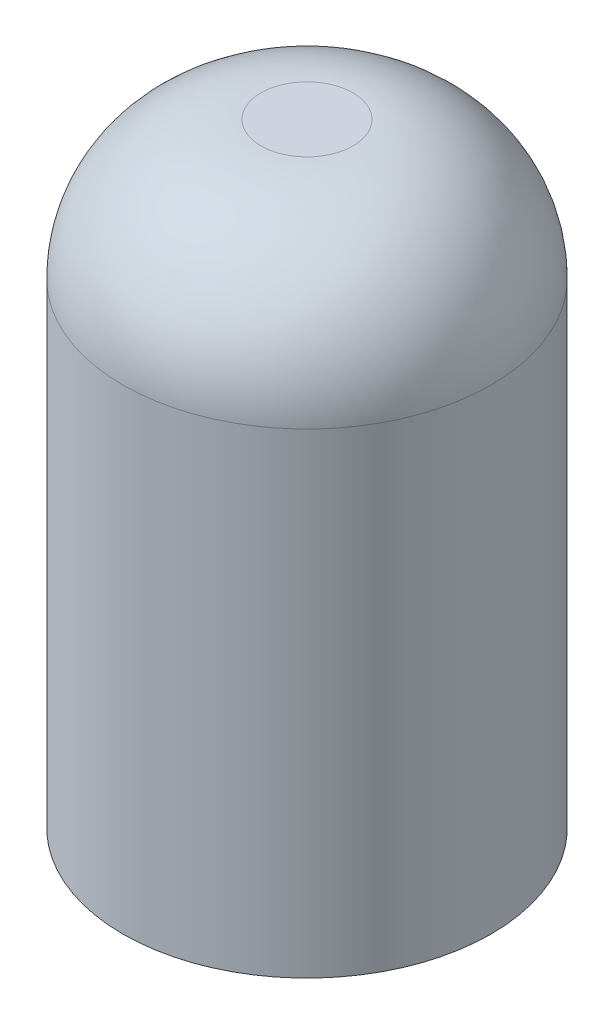
ISO-10303-21;
HEADER;
FILE_DESCRIPTION(('STEP AP214'),'2;1');
FILE_NAME('part.step','',(''),(''),'','','');
FILE_SCHEMA(('AUTOMOTIVE_DESIGN { 1 0 10303 214 1 1 1 1 }'));
ENDSEC;
DATA;
#1=APPLICATION_CONTEXT('core data for automotive mechanical design processes');
#2=APPLICATION_PROTOCOL_DEFINITION('international standard','automotive_design',2000,#1);
#3=PRODUCT_CONTEXT('',#1,'mechanical');
#4=PRODUCT('Part','Part','',(#3));
#5=PRODUCT_RELATED_PRODUCT_CATEGORY('part','',(#4));
#6=PRODUCT_DEFINITION_FORMATION('','',#4);
#7=PRODUCT_DEFINITION_CONTEXT('part definition',#1,'design');
#8=PRODUCT_DEFINITION('design','',#6,#7);
#9=PRODUCT_DEFINITION_SHAPE('','',#8);
#10=(LENGTH_UNIT() NAMED_UNIT(*) SI_UNIT(.MILLI.,.METRE.));
#11=(NAMED_UNIT(*) PLANE_ANGLE_UNIT() SI_UNIT($,.RADIAN.));
#12=(NAMED_UNIT(*) SI_UNIT($,.STERADIAN.) SOLID_ANGLE_UNIT());
#13=UNCERTAINTY_MEASURE_WITH_UNIT(LENGTH_MEASURE(1.E-05),#10,'distance_accuracy_value','');
#14=(GEOMETRIC_REPRESENTATION_CONTEXT(3) GLOBAL_UNCERTAINTY_ASSIGNED_CONTEXT((#13)) GLOBAL_UNIT_ASSIGNED_CONTEXT((#10,
#11,#12)) REPRESENTATION_CONTEXT('',''));
#15=CARTESIAN_POINT('',(0.,0.,0.));
#16=DIRECTION('',(0.,0.,1.));
#17=DIRECTION('',(1.,0.,0.));
#18=AXIS2_PLACEMENT_3D('',#15,#16,#17);
#19=CARTESIAN_POINT('',(0.,0.,0.));
#20=DIRECTION('',(0.,1.,0.));
#21=DIRECTION('',(-1.,0.,0.));
#22=AXIS2_PLACEMENT_3D('',#19,#20,#21);
#23=PLANE('',#22);
#24=CARTESIAN_POINT('',(0.,0.,0.));
#25=DIRECTION('',(0.,1.,0.));
#26=DIRECTION('',(-1.,0.,0.));
#27=AXIS2_PLACEMENT_3D('',#24,#25,#26);
#28=CIRCLE('',#27,57.9999999999998);
#29=CARTESIAN_POINT('',(-57.9999999999998,2.56578741862219E-13,0.));
#30=VERTEX_POINT('',#29);
#31=EDGE_CURVE('E45',#30,#30,#28,.T.);
#32=ORIENTED_EDGE('',*,*,#31,.T.);
#33=EDGE_LOOP('',(#32));
#34=FACE_BOUND('',#33,.T.);
#35=CARTESIAN_POINT('',(0.,1.66533453693773E-13,0.));
#36=DIRECTION('',(0.,1.,0.));
#37=DIRECTION('',(-1.,0.,0.));
#38=AXIS2_PLACEMENT_3D('',#35,#36,#37);
#39=CIRCLE('',#38,60.0000000000001);
#40=CARTESIAN_POINT('',(-60.0000000000001,3.45821745088946E-13,0.));
#41=VERTEX_POINT('',#40);
#42=EDGE_CURVE('E10',#41,#41,#39,.T.);
#43=ORIENTED_EDGE('',*,*,#42,.F.);
#44=EDGE_LOOP('',(#43));
#45=FACE_BOUND('',#44,.T.);
#46=ADVANCED_FACE('F31',(#34,#45),#23,.F.);
#47=CARTESIAN_POINT('',(5.97627637983908E-13,200.,0.));
#48=DIRECTION('',(0.,1.,0.));
#49=DIRECTION('',(-1.,0.,0.));
#50=AXIS2_PLACEMENT_3D('',#47,#48,#49);
#51=CYLINDRICAL_SURFACE('',#50,59.9999999999998);
#52=CARTESIAN_POINT('',(4.63161419437529E-13,155.,0.));
#53=DIRECTION('',(0.,1.,0.));
#54=DIRECTION('',(-1.,0.,0.));
#55=AXIS2_PLACEMENT_3D('',#52,#53,#54);
#56=CIRCLE('',#55,59.9999999999995);
#57=CARTESIAN_POINT('',(-59.9999999999991,155.,0.));
#58=VERTEX_POINT('',#57);
#59=EDGE_CURVE('E37',#58,#58,#56,.T.);
#60=ORIENTED_EDGE('',*,*,#59,.F.);
#61=EDGE_LOOP('',(#60));
#62=FACE_BOUND('',#61,.T.);
#63=ORIENTED_EDGE('',*,*,#42,.T.);
#64=EDGE_LOOP('',(#63));
#65=FACE_BOUND('',#64,.T.);
#66=ADVANCED_FACE('F74',(#62,#65),#51,.T.);
#67=CARTESIAN_POINT('',(4.63171168085807E-13,155.,0.));
#68=DIRECTION('',(0.,1.,0.));
#69=DIRECTION('',(-1.,0.,0.));
#70=AXIS2_PLACEMENT_3D('',#67,#68,#69);
#71=DEGENERATE_TOROIDAL_SURFACE('',#70,14.9999999999995,45.,.T.);
#72=CARTESIAN_POINT('',(5.97627637983908E-13,200.,0.));
#73=DIRECTION('',(0.,1.,0.));
#74=DIRECTION('',(-1.,0.,0.));
#75=AXIS2_PLACEMENT_3D('',#72,#73,#74);
#76=CIRCLE('',#75,14.9999999999994);
#77=CARTESIAN_POINT('',(-14.9999999999988,200.,0.));
#78=VERTEX_POINT('',#77);
#79=EDGE_CURVE('E41',#78,#78,#76,.T.);
#80=ORIENTED_EDGE('',*,*,#79,.F.);
#81=EDGE_LOOP('',(#80));
#82=FACE_BOUND('',#81,.T.);
#83=ORIENTED_EDGE('',*,*,#59,.T.);
#84=EDGE_LOOP('',(#83));
#85=FACE_BOUND('',#84,.T.);
#86=ADVANCED_FACE('F79',(#82,#85),#71,.T.);
#87=CARTESIAN_POINT('',(15.,200.,0.));
#88=DIRECTION('',(0.,-1.,0.));
#89=DIRECTION('',(1.,0.,0.));
#90=AXIS2_PLACEMENT_3D('',#87,#88,#89);
#91=PLANE('',#90);
#92=ORIENTED_EDGE('',*,*,#79,.T.);
#93=EDGE_LOOP('',(#92));
#94=FACE_BOUND('',#93,.T.);
#95=ADVANCED_FACE('F71',(#94),#91,.F.);
#96=CARTESIAN_POINT('',(5.97627637983908E-13,200.,0.));
#97=DIRECTION('',(0.,1.,0.));
#98=DIRECTION('',(-1.,0.,0.));
#99=AXIS2_PLACEMENT_3D('',#96,#97,#98);
#100=CYLINDRICAL_SURFACE('',#99,57.9999999999998);
#101=CARTESIAN_POINT('',(4.63171168085808E-13,155.,0.));
#102=DIRECTION('',(0.,1.,0.));
#103=DIRECTION('',(-1.,0.,0.));
#104=AXIS2_PLACEMENT_3D('',#101,#102,#103);
#105=CIRCLE('',#104,57.9999999999995);
#106=CARTESIAN_POINT('',(-57.9999999999991,155.,0.));
#107=VERTEX_POINT('',#106);
#108=EDGE_CURVE('E50',#107,#107,#105,.T.);
#109=ORIENTED_EDGE('',*,*,#108,.T.);
#110=EDGE_LOOP('',(#109));
#111=FACE_BOUND('',#110,.T.);
#112=ORIENTED_EDGE('',*,*,#31,.F.);
#113=EDGE_LOOP('',(#112));
#114=FACE_BOUND('',#113,.T.);
#115=ADVANCED_FACE('F57',(#111,#114),#100,.F.);
#116=CARTESIAN_POINT('',(4.63171168085807E-13,155.,0.));
#117=DIRECTION('',(0.,1.,0.));
#118=DIRECTION('',(-1.,0.,0.));
#119=AXIS2_PLACEMENT_3D('',#116,#117,#118);
#120=DEGENERATE_TOROIDAL_SURFACE('',#119,14.9999999999995,43.,.T.);
#121=CARTESIAN_POINT('',(5.91661110252348E-13,198.,0.));
#122=DIRECTION('',(0.,1.,0.));
#123=DIRECTION('',(-1.,0.,0.));
#124=AXIS2_PLACEMENT_3D('',#121,#122,#123);
#125=CIRCLE('',#124,14.9999999999994);
#126=CARTESIAN_POINT('',(-14.9999999999988,198.,0.));
#127=VERTEX_POINT('',#126);
#128=EDGE_CURVE('E51',#127,#127,#125,.T.);
#129=ORIENTED_EDGE('',*,*,#128,.T.);
#130=EDGE_LOOP('',(#129));
#131=FACE_BOUND('',#130,.T.);
#132=ORIENTED_EDGE('',*,*,#108,.F.);
#133=EDGE_LOOP('',(#132));
#134=FACE_BOUND('',#133,.T.);
#135=ADVANCED_FACE('F60',(#131,#134),#120,.F.);
#136=CARTESIAN_POINT('',(15.,198.,0.));
#137=DIRECTION('',(0.,-1.,0.));
#138=DIRECTION('',(1.,0.,0.));
#139=AXIS2_PLACEMENT_3D('',#136,#137,#138);
#140=PLANE('',#139);
#141=ORIENTED_EDGE('',*,*,#128,.F.);
#142=EDGE_LOOP('',(#141));
#143=FACE_BOUND('',#142,.T.);
#144=ADVANCED_FACE('F62',(#143),#140,.T.);
#145=CLOSED_SHELL('',(#46,#66,#86,#95,#115,#135,#144));
#146=MANIFOLD_SOLID_BREP('B2',#145);
#147=ADVANCED_BREP_SHAPE_REPRESENTATION('',(#18,#146),#14);
#148=SHAPE_DEFINITION_REPRESENTATION(#9,#147);
ENDSEC;
END-ISO-10303-21;
